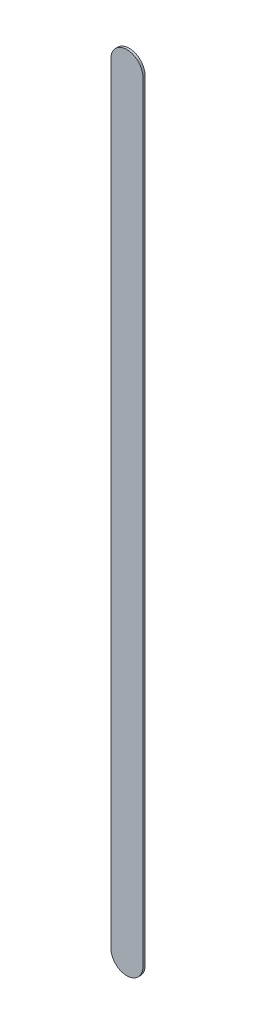
ISO-10303-21;
HEADER;
FILE_DESCRIPTION(('STEP AP214'),'2;1');
FILE_NAME('part.step','',(''),(''),'','','');
FILE_SCHEMA(('AUTOMOTIVE_DESIGN { 1 0 10303 214 1 1 1 1 }'));
ENDSEC;
DATA;
#1=APPLICATION_CONTEXT('core data for automotive mechanical design processes');
#2=APPLICATION_PROTOCOL_DEFINITION('international standard','automotive_design',2000,#1);
#3=PRODUCT_CONTEXT('',#1,'mechanical');
#4=PRODUCT('Part','Part','',(#3));
#5=PRODUCT_RELATED_PRODUCT_CATEGORY('part','',(#4));
#6=PRODUCT_DEFINITION_FORMATION('','',#4);
#7=PRODUCT_DEFINITION_CONTEXT('part definition',#1,'design');
#8=PRODUCT_DEFINITION('design','',#6,#7);
#9=PRODUCT_DEFINITION_SHAPE('','',#8);
#10=(LENGTH_UNIT() NAMED_UNIT(*) SI_UNIT(.MILLI.,.METRE.));
#11=(NAMED_UNIT(*) PLANE_ANGLE_UNIT() SI_UNIT($,.RADIAN.));
#12=(NAMED_UNIT(*) SI_UNIT($,.STERADIAN.) SOLID_ANGLE_UNIT());
#13=UNCERTAINTY_MEASURE_WITH_UNIT(LENGTH_MEASURE(1.E-05),#10,'distance_accuracy_value','');
#14=(GEOMETRIC_REPRESENTATION_CONTEXT(3) GLOBAL_UNCERTAINTY_ASSIGNED_CONTEXT((#13)) GLOBAL_UNIT_ASSIGNED_CONTEXT((#10,
#11,#12)) REPRESENTATION_CONTEXT('',''));
#15=CARTESIAN_POINT('',(0.,0.,0.));
#16=DIRECTION('',(0.,0.,1.));
#17=DIRECTION('',(1.,0.,0.));
#18=AXIS2_PLACEMENT_3D('',#15,#16,#17);
#19=CARTESIAN_POINT('',(80.1583995,103.5483832,0.));
#20=DIRECTION('',(-1.,0.,0.));
#21=DIRECTION('',(0.,1.,0.));
#22=AXIS2_PLACEMENT_3D('',#19,#20,#21);
#23=PLANE('',#22);
#24=DIRECTION('',(0.,1.,0.));
#25=VECTOR('',#24,1.);
#26=CARTESIAN_POINT('',(80.1583995,103.5483832,0.03556));
#27=LINE('',#26,#25);
#28=CARTESIAN_POINT('',(80.1583995,103.5483832,0.03556));
#29=VERTEX_POINT('',#28);
#30=CARTESIAN_POINT('',(80.1583995,115.54841,0.03556));
#31=VERTEX_POINT('',#30);
#32=EDGE_CURVE('E11',#29,#31,#27,.T.);
#33=ORIENTED_EDGE('',*,*,#32,.F.);
#34=DIRECTION('',(0.,0.,1.));
#35=VECTOR('',#34,1.);
#36=CARTESIAN_POINT('',(80.1583995,103.5483832,0.));
#37=LINE('',#36,#35);
#38=CARTESIAN_POINT('',(80.1583995,103.5483832,0.));
#39=VERTEX_POINT('',#38);
#40=EDGE_CURVE('E24',#39,#29,#37,.T.);
#41=ORIENTED_EDGE('',*,*,#40,.F.);
#42=DIRECTION('',(0.,1.,0.));
#43=VECTOR('',#42,1.);
#44=CARTESIAN_POINT('',(80.1583995,103.5483832,0.));
#45=LINE('',#44,#43);
#46=CARTESIAN_POINT('',(80.1583995,115.54841,0.));
#47=VERTEX_POINT('',#46);
#48=EDGE_CURVE('E75',#39,#47,#45,.T.);
#49=ORIENTED_EDGE('',*,*,#48,.T.);
#50=DIRECTION('',(0.,0.,1.));
#51=VECTOR('',#50,1.);
#52=CARTESIAN_POINT('',(80.1583995,115.54841,0.));
#53=LINE('',#52,#51);
#54=EDGE_CURVE('E37',#47,#31,#53,.T.);
#55=ORIENTED_EDGE('',*,*,#54,.T.);
#56=EDGE_LOOP('',(#33,#41,#49,#55));
#57=FACE_BOUND('',#56,.T.);
#58=ADVANCED_FACE('F17',(#57),#23,.F.);
#59=CARTESIAN_POINT('',(79.9084,115.54841,0.));
#60=DIRECTION('',(0.,0.,-1.));
#61=DIRECTION('',(1.,0.,0.));
#62=AXIS2_PLACEMENT_3D('',#59,#60,#61);
#63=CYLINDRICAL_SURFACE('',#62,0.249999500000001);
#64=CARTESIAN_POINT('',(79.9084,115.54841,0.03556));
#65=DIRECTION('',(0.,0.,1.));
#66=DIRECTION('',(1.,0.,0.));
#67=AXIS2_PLACEMENT_3D('',#64,#65,#66);
#68=CIRCLE('',#67,0.249999500000001);
#69=CARTESIAN_POINT('',(79.6584005,115.54841,0.03556));
#70=VERTEX_POINT('',#69);
#71=EDGE_CURVE('E83',#31,#70,#68,.T.);
#72=ORIENTED_EDGE('',*,*,#71,.F.);
#73=ORIENTED_EDGE('',*,*,#54,.F.);
#74=CARTESIAN_POINT('',(79.9084,115.54841,0.));
#75=DIRECTION('',(0.,0.,1.));
#76=DIRECTION('',(1.,0.,0.));
#77=AXIS2_PLACEMENT_3D('',#74,#75,#76);
#78=CIRCLE('',#77,0.249999500000001);
#79=CARTESIAN_POINT('',(79.6584005,115.54841,0.));
#80=VERTEX_POINT('',#79);
#81=EDGE_CURVE('E81',#47,#80,#78,.T.);
#82=ORIENTED_EDGE('',*,*,#81,.T.);
#83=DIRECTION('',(0.,0.,1.));
#84=VECTOR('',#83,1.);
#85=CARTESIAN_POINT('',(79.6584005,115.54841,0.));
#86=LINE('',#85,#84);
#87=EDGE_CURVE('E67',#80,#70,#86,.T.);
#88=ORIENTED_EDGE('',*,*,#87,.T.);
#89=EDGE_LOOP('',(#72,#73,#82,#88));
#90=FACE_BOUND('',#89,.T.);
#91=ADVANCED_FACE('F89',(#90),#63,.T.);
#92=CARTESIAN_POINT('',(79.6584005,115.54841,0.));
#93=DIRECTION('',(1.,0.,0.));
#94=DIRECTION('',(0.,-1.,0.));
#95=AXIS2_PLACEMENT_3D('',#92,#93,#94);
#96=PLANE('',#95);
#97=DIRECTION('',(0.,-1.,0.));
#98=VECTOR('',#97,1.);
#99=CARTESIAN_POINT('',(79.6584005,115.54841,0.03556));
#100=LINE('',#99,#98);
#101=CARTESIAN_POINT('',(79.6584005,103.5483832,0.03556));
#102=VERTEX_POINT('',#101);
#103=EDGE_CURVE('E71',#70,#102,#100,.T.);
#104=ORIENTED_EDGE('',*,*,#103,.F.);
#105=ORIENTED_EDGE('',*,*,#87,.F.);
#106=DIRECTION('',(0.,-1.,0.));
#107=VECTOR('',#106,1.);
#108=CARTESIAN_POINT('',(79.6584005,115.54841,0.));
#109=LINE('',#108,#107);
#110=CARTESIAN_POINT('',(79.6584005,103.5483832,0.));
#111=VERTEX_POINT('',#110);
#112=EDGE_CURVE('E63',#80,#111,#109,.T.);
#113=ORIENTED_EDGE('',*,*,#112,.T.);
#114=DIRECTION('',(0.,0.,1.));
#115=VECTOR('',#114,1.);
#116=CARTESIAN_POINT('',(79.6584005,103.5483832,0.));
#117=LINE('',#116,#115);
#118=EDGE_CURVE('E53',#111,#102,#117,.T.);
#119=ORIENTED_EDGE('',*,*,#118,.T.);
#120=EDGE_LOOP('',(#104,#105,#113,#119));
#121=FACE_BOUND('',#120,.T.);
#122=ADVANCED_FACE('F66',(#121),#96,.F.);
#123=CARTESIAN_POINT('',(79.9084,103.5483832,0.));
#124=DIRECTION('',(0.,0.,-1.));
#125=DIRECTION('',(-1.,0.,0.));
#126=AXIS2_PLACEMENT_3D('',#123,#124,#125);
#127=CYLINDRICAL_SURFACE('',#126,0.249999500000001);
#128=CARTESIAN_POINT('',(79.9084,103.5483832,0.03556));
#129=DIRECTION('',(0.,0.,1.));
#130=DIRECTION('',(-1.,0.,0.));
#131=AXIS2_PLACEMENT_3D('',#128,#129,#130);
#132=CIRCLE('',#131,0.249999500000001);
#133=EDGE_CURVE('E59',#102,#29,#132,.T.);
#134=ORIENTED_EDGE('',*,*,#133,.F.);
#135=ORIENTED_EDGE('',*,*,#118,.F.);
#136=CARTESIAN_POINT('',(79.9084,103.5483832,0.));
#137=DIRECTION('',(0.,0.,1.));
#138=DIRECTION('',(-1.,0.,0.));
#139=AXIS2_PLACEMENT_3D('',#136,#137,#138);
#140=CIRCLE('',#139,0.249999500000001);
#141=EDGE_CURVE('E57',#111,#39,#140,.T.);
#142=ORIENTED_EDGE('',*,*,#141,.T.);
#143=ORIENTED_EDGE('',*,*,#40,.T.);
#144=EDGE_LOOP('',(#134,#135,#142,#143));
#145=FACE_BOUND('',#144,.T.);
#146=ADVANCED_FACE('F55',(#145),#127,.T.);
#147=CARTESIAN_POINT('',(80.1583995,103.5483832,0.));
#148=DIRECTION('',(0.,0.,-1.));
#149=DIRECTION('',(-1.,0.,0.));
#150=AXIS2_PLACEMENT_3D('',#147,#148,#149);
#151=PLANE('',#150);
#152=ORIENTED_EDGE('',*,*,#141,.F.);
#153=ORIENTED_EDGE('',*,*,#112,.F.);
#154=ORIENTED_EDGE('',*,*,#81,.F.);
#155=ORIENTED_EDGE('',*,*,#48,.F.);
#156=EDGE_LOOP('',(#152,#153,#154,#155));
#157=FACE_BOUND('',#156,.T.);
#158=ADVANCED_FACE('F74',(#157),#151,.T.);
#159=CARTESIAN_POINT('',(80.1583995,103.5483832,0.03556));
#160=DIRECTION('',(0.,0.,-1.));
#161=DIRECTION('',(-1.,0.,0.));
#162=AXIS2_PLACEMENT_3D('',#159,#160,#161);
#163=PLANE('',#162);
#164=ORIENTED_EDGE('',*,*,#32,.T.);
#165=ORIENTED_EDGE('',*,*,#71,.T.);
#166=ORIENTED_EDGE('',*,*,#103,.T.);
#167=ORIENTED_EDGE('',*,*,#133,.T.);
#168=EDGE_LOOP('',(#164,#165,#166,#167));
#169=FACE_BOUND('',#168,.T.);
#170=ADVANCED_FACE('F91',(#169),#163,.F.);
#171=CLOSED_SHELL('',(#58,#91,#122,#146,#158,#170));
#172=MANIFOLD_SOLID_BREP('B1',#171);
#173=ADVANCED_BREP_SHAPE_REPRESENTATION('',(#18,#172),#14);
#174=SHAPE_DEFINITION_REPRESENTATION(#9,#173);
ENDSEC;
END-ISO-10303-21;
